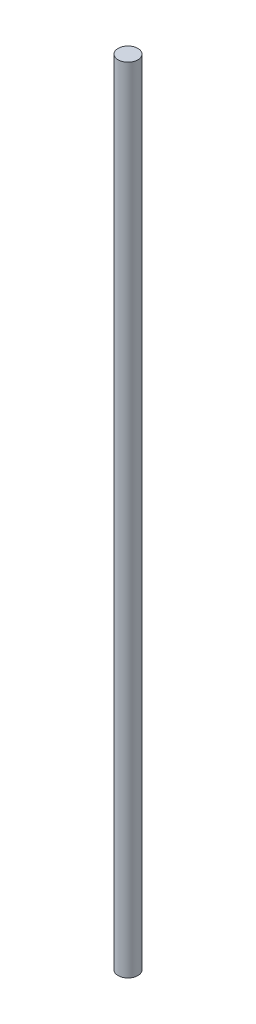
ISO-10303-21;
HEADER;
FILE_DESCRIPTION(('STEP AP214'),'2;1');
FILE_NAME('part.step','',(''),(''),'','','');
FILE_SCHEMA(('AUTOMOTIVE_DESIGN { 1 0 10303 214 1 1 1 1 }'));
ENDSEC;
DATA;
#1=APPLICATION_CONTEXT('core data for automotive mechanical design processes');
#2=APPLICATION_PROTOCOL_DEFINITION('international standard','automotive_design',2000,#1);
#3=PRODUCT_CONTEXT('',#1,'mechanical');
#4=PRODUCT('Part','Part','',(#3));
#5=PRODUCT_RELATED_PRODUCT_CATEGORY('part','',(#4));
#6=PRODUCT_DEFINITION_FORMATION('','',#4);
#7=PRODUCT_DEFINITION_CONTEXT('part definition',#1,'design');
#8=PRODUCT_DEFINITION('design','',#6,#7);
#9=PRODUCT_DEFINITION_SHAPE('','',#8);
#10=(LENGTH_UNIT() NAMED_UNIT(*) SI_UNIT(.MILLI.,.METRE.));
#11=(NAMED_UNIT(*) PLANE_ANGLE_UNIT() SI_UNIT($,.RADIAN.));
#12=(NAMED_UNIT(*) SI_UNIT($,.STERADIAN.) SOLID_ANGLE_UNIT());
#13=UNCERTAINTY_MEASURE_WITH_UNIT(LENGTH_MEASURE(1.E-05),#10,'distance_accuracy_value','');
#14=(GEOMETRIC_REPRESENTATION_CONTEXT(3) GLOBAL_UNCERTAINTY_ASSIGNED_CONTEXT((#13)) GLOBAL_UNIT_ASSIGNED_CONTEXT((#10,
#11,#12)) REPRESENTATION_CONTEXT('',''));
#15=CARTESIAN_POINT('',(0.,0.,0.));
#16=DIRECTION('',(0.,0.,1.));
#17=DIRECTION('',(1.,0.,0.));
#18=AXIS2_PLACEMENT_3D('',#15,#16,#17);
#19=CARTESIAN_POINT('',(0.,110.,0.));
#20=DIRECTION('',(0.,-1.,0.));
#21=DIRECTION('',(0.,0.,-1.));
#22=AXIS2_PLACEMENT_3D('',#19,#20,#21);
#23=CYLINDRICAL_SURFACE('',#22,2.75);
#24=CARTESIAN_POINT('',(0.,110.,0.));
#25=DIRECTION('',(0.,1.,0.));
#26=DIRECTION('',(0.,0.,1.));
#27=AXIS2_PLACEMENT_3D('',#24,#25,#26);
#28=CIRCLE('',#27,2.75);
#29=CARTESIAN_POINT('',(0.,110.,2.75));
#30=VERTEX_POINT('',#29);
#31=EDGE_CURVE('E10',#30,#30,#28,.T.);
#32=ORIENTED_EDGE('',*,*,#31,.F.);
#33=EDGE_LOOP('',(#32));
#34=FACE_BOUND('',#33,.T.);
#35=CARTESIAN_POINT('',(0.,-110.,0.));
#36=DIRECTION('',(0.,1.,0.));
#37=DIRECTION('',(0.,0.,1.));
#38=AXIS2_PLACEMENT_3D('',#35,#36,#37);
#39=CIRCLE('',#38,2.75);
#40=CARTESIAN_POINT('',(0.,-110.,2.75));
#41=VERTEX_POINT('',#40);
#42=EDGE_CURVE('E33',#41,#41,#39,.T.);
#43=ORIENTED_EDGE('',*,*,#42,.T.);
#44=EDGE_LOOP('',(#43));
#45=FACE_BOUND('',#44,.T.);
#46=ADVANCED_FACE('F30',(#34,#45),#23,.T.);
#47=CARTESIAN_POINT('',(0.,110.,0.));
#48=DIRECTION('',(0.,1.,0.));
#49=DIRECTION('',(0.,0.,1.));
#50=AXIS2_PLACEMENT_3D('',#47,#48,#49);
#51=PLANE('',#50);
#52=ORIENTED_EDGE('',*,*,#31,.T.);
#53=EDGE_LOOP('',(#52));
#54=FACE_BOUND('',#53,.T.);
#55=ADVANCED_FACE('F45',(#54),#51,.T.);
#56=CARTESIAN_POINT('',(0.,-110.,0.));
#57=DIRECTION('',(0.,1.,0.));
#58=DIRECTION('',(0.,0.,1.));
#59=AXIS2_PLACEMENT_3D('',#56,#57,#58);
#60=PLANE('',#59);
#61=ORIENTED_EDGE('',*,*,#42,.F.);
#62=EDGE_LOOP('',(#61));
#63=FACE_BOUND('',#62,.T.);
#64=ADVANCED_FACE('F43',(#63),#60,.F.);
#65=CLOSED_SHELL('',(#46,#55,#64));
#66=MANIFOLD_SOLID_BREP('B2',#65);
#67=ADVANCED_BREP_SHAPE_REPRESENTATION('',(#18,#66),#14);
#68=SHAPE_DEFINITION_REPRESENTATION(#9,#67);
ENDSEC;
END-ISO-10303-21;
